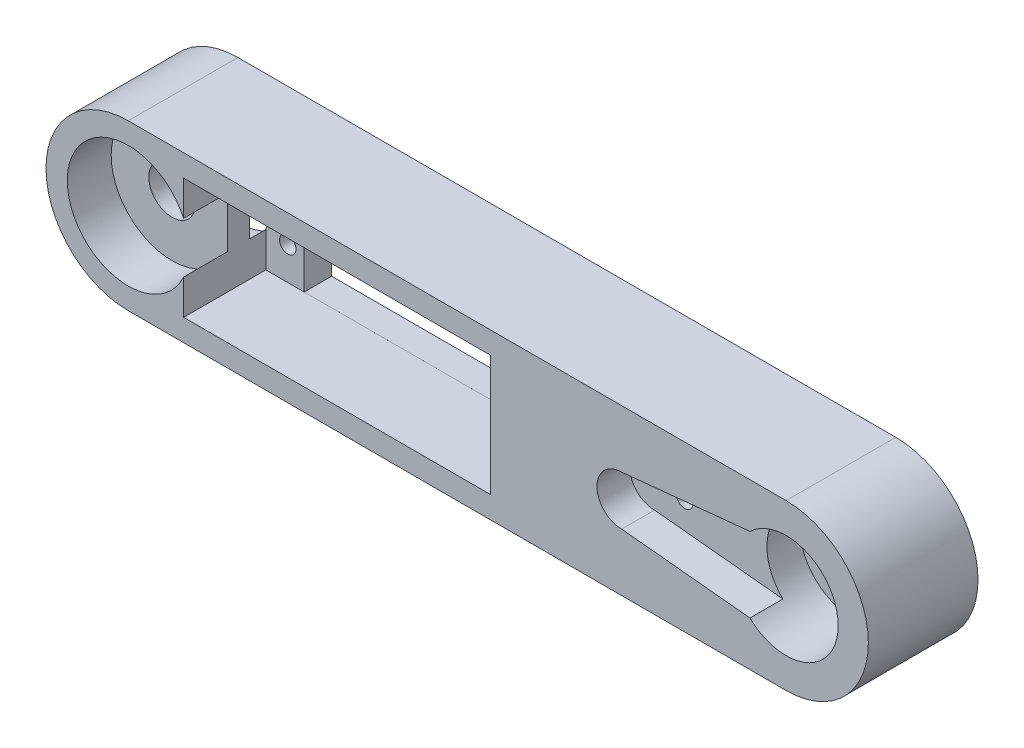
ISO-10303-21;
HEADER;
FILE_DESCRIPTION(('STEP AP214'),'2;1');
FILE_NAME('part.step','',(''),(''),'','','');
FILE_SCHEMA(('AUTOMOTIVE_DESIGN { 1 0 10303 214 1 1 1 1 }'));
ENDSEC;
DATA;
#1=APPLICATION_CONTEXT('core data for automotive mechanical design processes');
#2=APPLICATION_PROTOCOL_DEFINITION('international standard','automotive_design',2000,#1);
#3=PRODUCT_CONTEXT('',#1,'mechanical');
#4=PRODUCT('Part','Part','',(#3));
#5=PRODUCT_RELATED_PRODUCT_CATEGORY('part','',(#4));
#6=PRODUCT_DEFINITION_FORMATION('','',#4);
#7=PRODUCT_DEFINITION_CONTEXT('part definition',#1,'design');
#8=PRODUCT_DEFINITION('design','',#6,#7);
#9=PRODUCT_DEFINITION_SHAPE('','',#8);
#10=(LENGTH_UNIT() NAMED_UNIT(*) SI_UNIT(.MILLI.,.METRE.));
#11=(NAMED_UNIT(*) PLANE_ANGLE_UNIT() SI_UNIT($,.RADIAN.));
#12=(NAMED_UNIT(*) SI_UNIT($,.STERADIAN.) SOLID_ANGLE_UNIT());
#13=UNCERTAINTY_MEASURE_WITH_UNIT(LENGTH_MEASURE(1.E-05),#10,'distance_accuracy_value','');
#14=(GEOMETRIC_REPRESENTATION_CONTEXT(3) GLOBAL_UNCERTAINTY_ASSIGNED_CONTEXT((#13)) GLOBAL_UNIT_ASSIGNED_CONTEXT((#10,
#11,#12)) REPRESENTATION_CONTEXT('',''));
#15=CARTESIAN_POINT('',(0.,0.,0.));
#16=DIRECTION('',(0.,0.,1.));
#17=DIRECTION('',(1.,0.,0.));
#18=AXIS2_PLACEMENT_3D('',#15,#16,#17);
#19=CARTESIAN_POINT('',(0.,0.,-10.));
#20=DIRECTION('',(0.,0.,1.));
#21=DIRECTION('',(1.,0.,0.));
#22=AXIS2_PLACEMENT_3D('',#19,#20,#21);
#23=PLANE('',#22);
#24=CARTESIAN_POINT('',(14.1,-5.,-10.));
#25=DIRECTION('',(0.,0.,1.));
#26=DIRECTION('',(1.,0.,0.));
#27=AXIS2_PLACEMENT_3D('',#24,#25,#26);
#28=CIRCLE('',#27,1.5);
#29=CARTESIAN_POINT('',(15.6,-5.,-10.));
#30=VERTEX_POINT('',#29);
#31=EDGE_CURVE('E537',#30,#30,#28,.T.);
#32=ORIENTED_EDGE('',*,*,#31,.T.);
#33=EDGE_LOOP('',(#32));
#34=FACE_BOUND('',#33,.T.);
#35=CARTESIAN_POINT('',(14.1,5.,-10.));
#36=DIRECTION('',(0.,0.,1.));
#37=DIRECTION('',(1.,0.,0.));
#38=AXIS2_PLACEMENT_3D('',#35,#36,#37);
#39=CIRCLE('',#38,1.5);
#40=CARTESIAN_POINT('',(15.6,5.,-10.));
#41=VERTEX_POINT('',#40);
#42=EDGE_CURVE('E533',#41,#41,#39,.T.);
#43=ORIENTED_EDGE('',*,*,#42,.T.);
#44=EDGE_LOOP('',(#43));
#45=FACE_BOUND('',#44,.T.);
#46=CARTESIAN_POINT('',(0.,0.,-10.));
#47=DIRECTION('',(0.,0.,-1.));
#48=DIRECTION('',(-1.,0.,0.));
#49=AXIS2_PLACEMENT_3D('',#46,#47,#48);
#50=CIRCLE('',#49,11.11);
#51=CARTESIAN_POINT('',(-11.11,0.,-10.));
#52=VERTEX_POINT('',#51);
#53=EDGE_CURVE('E281',#52,#52,#50,.T.);
#54=ORIENTED_EDGE('',*,*,#53,.F.);
#55=EDGE_LOOP('',(#54));
#56=FACE_BOUND('',#55,.T.);
#57=DIRECTION('',(0.,1.,0.));
#58=VECTOR('',#57,1.);
#59=CARTESIAN_POINT('',(59.1,-11.,-10.));
#60=LINE('',#59,#58);
#61=CARTESIAN_POINT('',(59.1,-11.,-10.));
#62=VERTEX_POINT('',#61);
#63=CARTESIAN_POINT('',(59.1,11.,-10.));
#64=VERTEX_POINT('',#63);
#65=EDGE_CURVE('E357',#62,#64,#60,.T.);
#66=ORIENTED_EDGE('',*,*,#65,.T.);
#67=DIRECTION('',(-1.,0.,0.));
#68=VECTOR('',#67,1.);
#69=CARTESIAN_POINT('',(59.1,11.,-10.));
#70=LINE('',#69,#68);
#71=CARTESIAN_POINT('',(17.1,11.,-10.));
#72=VERTEX_POINT('',#71);
#73=EDGE_CURVE('E379',#64,#72,#70,.T.);
#74=ORIENTED_EDGE('',*,*,#73,.T.);
#75=DIRECTION('',(0.,1.,0.));
#76=VECTOR('',#75,1.);
#77=CARTESIAN_POINT('',(17.1,-11.,-10.));
#78=LINE('',#77,#76);
#79=CARTESIAN_POINT('',(17.1,-11.,-10.));
#80=VERTEX_POINT('',#79);
#81=EDGE_CURVE('E376',#80,#72,#78,.T.);
#82=ORIENTED_EDGE('',*,*,#81,.F.);
#83=DIRECTION('',(-1.,0.,0.));
#84=VECTOR('',#83,1.);
#85=CARTESIAN_POINT('',(59.1,-11.,-10.));
#86=LINE('',#85,#84);
#87=EDGE_CURVE('E372',#62,#80,#86,.T.);
#88=ORIENTED_EDGE('',*,*,#87,.F.);
#89=EDGE_LOOP('',(#66,#74,#82,#88));
#90=FACE_BOUND('',#89,.T.);
#91=CARTESIAN_POINT('',(120.,0.,-10.));
#92=DIRECTION('',(0.,0.,1.));
#93=DIRECTION('',(1.,0.,0.));
#94=AXIS2_PLACEMENT_3D('',#91,#92,#93);
#95=CIRCLE('',#94,4.25000000000001);
#96=CARTESIAN_POINT('',(124.25,0.,-10.));
#97=VERTEX_POINT('',#96);
#98=EDGE_CURVE('E383',#97,#97,#95,.T.);
#99=ORIENTED_EDGE('',*,*,#98,.T.);
#100=EDGE_LOOP('',(#99));
#101=FACE_BOUND('',#100,.T.);
#102=DIRECTION('',(1.,0.,0.));
#103=VECTOR('',#102,1.);
#104=CARTESIAN_POINT('',(0.,-15.,-10.));
#105=LINE('',#104,#103);
#106=CARTESIAN_POINT('',(0.,-15.,-10.));
#107=VERTEX_POINT('',#106);
#108=CARTESIAN_POINT('',(120.,-15.,-10.));
#109=VERTEX_POINT('',#108);
#110=EDGE_CURVE('E223',#107,#109,#105,.T.);
#111=ORIENTED_EDGE('',*,*,#110,.F.);
#112=CARTESIAN_POINT('',(0.,0.,-10.));
#113=DIRECTION('',(0.,0.,1.));
#114=DIRECTION('',(1.,0.,0.));
#115=AXIS2_PLACEMENT_3D('',#112,#113,#114);
#116=CIRCLE('',#115,15.);
#117=CARTESIAN_POINT('',(0.,15.,-10.));
#118=VERTEX_POINT('',#117);
#119=EDGE_CURVE('E233',#118,#107,#116,.T.);
#120=ORIENTED_EDGE('',*,*,#119,.F.);
#121=DIRECTION('',(1.,0.,0.));
#122=VECTOR('',#121,1.);
#123=CARTESIAN_POINT('',(0.,15.,-10.));
#124=LINE('',#123,#122);
#125=CARTESIAN_POINT('',(120.,15.,-10.));
#126=VERTEX_POINT('',#125);
#127=EDGE_CURVE('E251',#118,#126,#124,.T.);
#128=ORIENTED_EDGE('',*,*,#127,.T.);
#129=CARTESIAN_POINT('',(120.,0.,-10.));
#130=DIRECTION('',(0.,0.,1.));
#131=DIRECTION('',(1.,0.,0.));
#132=AXIS2_PLACEMENT_3D('',#129,#130,#131);
#133=CIRCLE('',#132,15.);
#134=EDGE_CURVE('E247',#109,#126,#133,.T.);
#135=ORIENTED_EDGE('',*,*,#134,.F.);
#136=EDGE_LOOP('',(#111,#120,#128,#135));
#137=FACE_BOUND('',#136,.T.);
#138=CARTESIAN_POINT('',(62.1,-5.00000000000001,-10.));
#139=DIRECTION('',(0.,0.,1.));
#140=DIRECTION('',(1.,0.,0.));
#141=AXIS2_PLACEMENT_3D('',#138,#139,#140);
#142=CIRCLE('',#141,1.49999999999998);
#143=CARTESIAN_POINT('',(63.6,-5.00000000000001,-10.));
#144=VERTEX_POINT('',#143);
#145=EDGE_CURVE('E540',#144,#144,#142,.F.);
#146=ORIENTED_EDGE('',*,*,#145,.F.);
#147=EDGE_LOOP('',(#146));
#148=FACE_BOUND('',#147,.T.);
#149=CARTESIAN_POINT('',(62.1,5.,-10.));
#150=DIRECTION('',(0.,0.,1.));
#151=DIRECTION('',(1.,0.,0.));
#152=AXIS2_PLACEMENT_3D('',#149,#150,#151);
#153=CIRCLE('',#152,1.5);
#154=CARTESIAN_POINT('',(63.6,5.,-10.));
#155=VERTEX_POINT('',#154);
#156=EDGE_CURVE('E544',#155,#155,#153,.F.);
#157=ORIENTED_EDGE('',*,*,#156,.F.);
#158=EDGE_LOOP('',(#157));
#159=FACE_BOUND('',#158,.T.);
#160=ADVANCED_FACE('F47',(#34,#45,#56,#90,#101,#137,#148,#159),#23,.F.);
#161=CARTESIAN_POINT('',(0.,0.,-5.));
#162=DIRECTION('',(0.,0.,1.));
#163=DIRECTION('',(1.,0.,0.));
#164=AXIS2_PLACEMENT_3D('',#161,#162,#163);
#165=PLANE('',#164);
#166=CARTESIAN_POINT('',(62.1,-5.00000000000001,-5.));
#167=DIRECTION('',(0.,0.,1.));
#168=DIRECTION('',(1.,0.,0.));
#169=AXIS2_PLACEMENT_3D('',#166,#167,#168);
#170=CIRCLE('',#169,1.49999999999998);
#171=CARTESIAN_POINT('',(63.6,-5.00000000000001,-5.));
#172=VERTEX_POINT('',#171);
#173=EDGE_CURVE('E521',#172,#172,#170,.F.);
#174=ORIENTED_EDGE('',*,*,#173,.T.);
#175=EDGE_LOOP('',(#174));
#176=FACE_BOUND('',#175,.T.);
#177=CARTESIAN_POINT('',(14.1,-5.,-5.));
#178=DIRECTION('',(0.,0.,1.));
#179=DIRECTION('',(1.,0.,0.));
#180=AXIS2_PLACEMENT_3D('',#177,#178,#179);
#181=CIRCLE('',#180,1.5);
#182=CARTESIAN_POINT('',(15.6,-5.,-5.));
#183=VERTEX_POINT('',#182);
#184=EDGE_CURVE('E525',#183,#183,#181,.T.);
#185=ORIENTED_EDGE('',*,*,#184,.F.);
#186=EDGE_LOOP('',(#185));
#187=FACE_BOUND('',#186,.T.);
#188=CARTESIAN_POINT('',(14.1,5.,-5.));
#189=DIRECTION('',(0.,0.,1.));
#190=DIRECTION('',(1.,0.,0.));
#191=AXIS2_PLACEMENT_3D('',#188,#189,#190);
#192=CIRCLE('',#191,1.5);
#193=CARTESIAN_POINT('',(15.6,5.,-5.));
#194=VERTEX_POINT('',#193);
#195=EDGE_CURVE('E529',#194,#194,#192,.T.);
#196=ORIENTED_EDGE('',*,*,#195,.F.);
#197=EDGE_LOOP('',(#196));
#198=FACE_BOUND('',#197,.T.);
#199=CARTESIAN_POINT('',(0.,0.,-5.));
#200=DIRECTION('',(0.,0.,1.));
#201=DIRECTION('',(1.,0.,0.));
#202=AXIS2_PLACEMENT_3D('',#199,#200,#201);
#203=CIRCLE('',#202,11.11);
#204=CARTESIAN_POINT('',(10.1,4.62840145190541,-5.));
#205=VERTEX_POINT('',#204);
#206=CARTESIAN_POINT('',(10.1,-4.62840145190541,-5.));
#207=VERTEX_POINT('',#206);
#208=EDGE_CURVE('E56',#205,#207,#203,.F.);
#209=ORIENTED_EDGE('',*,*,#208,.T.);
#210=DIRECTION('',(0.,-1.,0.));
#211=VECTOR('',#210,1.);
#212=CARTESIAN_POINT('',(10.1,-11.0013577689779,-5.));
#213=LINE('',#212,#211);
#214=CARTESIAN_POINT('',(10.1,-11.0013577689779,-5.));
#215=VERTEX_POINT('',#214);
#216=EDGE_CURVE('E293',#207,#215,#213,.T.);
#217=ORIENTED_EDGE('',*,*,#216,.T.);
#218=DIRECTION('',(1.,0.,0.));
#219=VECTOR('',#218,1.);
#220=CARTESIAN_POINT('',(66.1,-11.0013577689779,-5.));
#221=LINE('',#220,#219);
#222=CARTESIAN_POINT('',(66.1,-11.0013577689779,-5.));
#223=VERTEX_POINT('',#222);
#224=EDGE_CURVE('E550',#215,#223,#221,.T.);
#225=ORIENTED_EDGE('',*,*,#224,.T.);
#226=DIRECTION('',(0.,1.,0.));
#227=VECTOR('',#226,1.);
#228=CARTESIAN_POINT('',(66.1,-11.0013577689779,-5.));
#229=LINE('',#228,#227);
#230=CARTESIAN_POINT('',(66.1,11.0013577689779,-5.));
#231=VERTEX_POINT('',#230);
#232=EDGE_CURVE('E553',#223,#231,#229,.T.);
#233=ORIENTED_EDGE('',*,*,#232,.T.);
#234=DIRECTION('',(-1.,0.,0.));
#235=VECTOR('',#234,1.);
#236=CARTESIAN_POINT('',(66.1,11.0013577689779,-5.));
#237=LINE('',#236,#235);
#238=CARTESIAN_POINT('',(10.1,11.0013577689779,-5.));
#239=VERTEX_POINT('',#238);
#240=EDGE_CURVE('E557',#231,#239,#237,.T.);
#241=ORIENTED_EDGE('',*,*,#240,.T.);
#242=EDGE_CURVE('E297',#239,#205,#213,.T.);
#243=ORIENTED_EDGE('',*,*,#242,.T.);
#244=EDGE_LOOP('',(#209,#217,#225,#233,#241,#243));
#245=FACE_BOUND('',#244,.T.);
#246=DIRECTION('',(1.,0.,0.));
#247=VECTOR('',#246,1.);
#248=CARTESIAN_POINT('',(59.1,11.,-5.));
#249=LINE('',#248,#247);
#250=CARTESIAN_POINT('',(17.1,11.,-5.));
#251=VERTEX_POINT('',#250);
#252=CARTESIAN_POINT('',(59.1,11.,-5.));
#253=VERTEX_POINT('',#252);
#254=EDGE_CURVE('E338',#251,#253,#249,.T.);
#255=ORIENTED_EDGE('',*,*,#254,.T.);
#256=DIRECTION('',(0.,-1.,0.));
#257=VECTOR('',#256,1.);
#258=CARTESIAN_POINT('',(59.1,-11.,-5.));
#259=LINE('',#258,#257);
#260=CARTESIAN_POINT('',(59.1,-11.,-5.));
#261=VERTEX_POINT('',#260);
#262=EDGE_CURVE('E335',#253,#261,#259,.T.);
#263=ORIENTED_EDGE('',*,*,#262,.T.);
#264=DIRECTION('',(1.,0.,0.));
#265=VECTOR('',#264,1.);
#266=CARTESIAN_POINT('',(59.1,-11.,-5.));
#267=LINE('',#266,#265);
#268=CARTESIAN_POINT('',(17.1,-11.,-5.));
#269=VERTEX_POINT('',#268);
#270=EDGE_CURVE('E70',#269,#261,#267,.T.);
#271=ORIENTED_EDGE('',*,*,#270,.F.);
#272=DIRECTION('',(0.,-1.,0.));
#273=VECTOR('',#272,1.);
#274=CARTESIAN_POINT('',(17.1,-11.,-5.));
#275=LINE('',#274,#273);
#276=EDGE_CURVE('E330',#251,#269,#275,.T.);
#277=ORIENTED_EDGE('',*,*,#276,.F.);
#278=EDGE_LOOP('',(#255,#263,#271,#277));
#279=FACE_BOUND('',#278,.T.);
#280=CARTESIAN_POINT('',(62.1,5.,-5.));
#281=DIRECTION('',(0.,0.,-1.));
#282=DIRECTION('',(-1.,0.,0.));
#283=AXIS2_PLACEMENT_3D('',#280,#281,#282);
#284=CIRCLE('',#283,1.5);
#285=CARTESIAN_POINT('',(60.6,5.,-5.));
#286=VERTEX_POINT('',#285);
#287=EDGE_CURVE('E203',#286,#286,#284,.T.);
#288=ORIENTED_EDGE('',*,*,#287,.T.);
#289=EDGE_LOOP('',(#288));
#290=FACE_BOUND('',#289,.T.);
#291=ADVANCED_FACE('F291',(#176,#187,#198,#245,#279,#290),#165,.T.);
#292=CARTESIAN_POINT('',(59.1,11.,-10.));
#293=DIRECTION('',(0.,1.,0.));
#294=DIRECTION('',(-1.,0.,0.));
#295=AXIS2_PLACEMENT_3D('',#292,#293,#294);
#296=PLANE('',#295);
#297=ORIENTED_EDGE('',*,*,#254,.F.);
#298=DIRECTION('',(0.,0.,1.));
#299=VECTOR('',#298,1.);
#300=CARTESIAN_POINT('',(17.1,11.,-10.));
#301=LINE('',#300,#299);
#302=EDGE_CURVE('E353',#72,#251,#301,.T.);
#303=ORIENTED_EDGE('',*,*,#302,.F.);
#304=ORIENTED_EDGE('',*,*,#73,.F.);
#305=DIRECTION('',(0.,0.,1.));
#306=VECTOR('',#305,1.);
#307=CARTESIAN_POINT('',(59.1,11.,-10.));
#308=LINE('',#307,#306);
#309=EDGE_CURVE('E275',#64,#253,#308,.T.);
#310=ORIENTED_EDGE('',*,*,#309,.T.);
#311=EDGE_LOOP('',(#297,#303,#304,#310));
#312=FACE_BOUND('',#311,.T.);
#313=ADVANCED_FACE('F441',(#312),#296,.F.);
#314=CARTESIAN_POINT('',(59.1,-11.,-10.));
#315=DIRECTION('',(1.,0.,0.));
#316=DIRECTION('',(0.,0.,-1.));
#317=AXIS2_PLACEMENT_3D('',#314,#315,#316);
#318=PLANE('',#317);
#319=ORIENTED_EDGE('',*,*,#262,.F.);
#320=ORIENTED_EDGE('',*,*,#309,.F.);
#321=ORIENTED_EDGE('',*,*,#65,.F.);
#322=DIRECTION('',(0.,0.,1.));
#323=VECTOR('',#322,1.);
#324=CARTESIAN_POINT('',(59.1,-11.,-10.));
#325=LINE('',#324,#323);
#326=EDGE_CURVE('E362',#62,#261,#325,.T.);
#327=ORIENTED_EDGE('',*,*,#326,.T.);
#328=EDGE_LOOP('',(#319,#320,#321,#327));
#329=FACE_BOUND('',#328,.T.);
#330=ADVANCED_FACE('F497',(#329),#318,.F.);
#331=CARTESIAN_POINT('',(59.1,-11.,-10.));
#332=DIRECTION('',(0.,1.,0.));
#333=DIRECTION('',(-1.,0.,0.));
#334=AXIS2_PLACEMENT_3D('',#331,#332,#333);
#335=PLANE('',#334);
#336=DIRECTION('',(0.,0.,1.));
#337=VECTOR('',#336,1.);
#338=CARTESIAN_POINT('',(17.1,-11.,-10.));
#339=LINE('',#338,#337);
#340=EDGE_CURVE('E358',#80,#269,#339,.T.);
#341=ORIENTED_EDGE('',*,*,#340,.T.);
#342=ORIENTED_EDGE('',*,*,#270,.T.);
#343=ORIENTED_EDGE('',*,*,#326,.F.);
#344=ORIENTED_EDGE('',*,*,#87,.T.);
#345=EDGE_LOOP('',(#341,#342,#343,#344));
#346=FACE_BOUND('',#345,.T.);
#347=ADVANCED_FACE('F489',(#346),#335,.T.);
#348=CARTESIAN_POINT('',(17.1,-11.,-10.));
#349=DIRECTION('',(1.,0.,0.));
#350=DIRECTION('',(0.,0.,-1.));
#351=AXIS2_PLACEMENT_3D('',#348,#349,#350);
#352=PLANE('',#351);
#353=ORIENTED_EDGE('',*,*,#302,.T.);
#354=ORIENTED_EDGE('',*,*,#276,.T.);
#355=ORIENTED_EDGE('',*,*,#340,.F.);
#356=ORIENTED_EDGE('',*,*,#81,.T.);
#357=EDGE_LOOP('',(#353,#354,#355,#356));
#358=FACE_BOUND('',#357,.T.);
#359=ADVANCED_FACE('F482',(#358),#352,.T.);
#360=CARTESIAN_POINT('',(0.,0.,-10.));
#361=DIRECTION('',(0.,0.,1.));
#362=DIRECTION('',(1.,0.,0.));
#363=AXIS2_PLACEMENT_3D('',#360,#361,#362);
#364=CYLINDRICAL_SURFACE('',#363,4.25);
#365=CARTESIAN_POINT('',(0.,0.,-2.));
#366=DIRECTION('',(0.,0.,-1.));
#367=DIRECTION('',(-1.,0.,0.));
#368=AXIS2_PLACEMENT_3D('',#365,#366,#367);
#369=CIRCLE('',#368,4.25);
#370=CARTESIAN_POINT('',(-4.25,0.,-2.));
#371=VERTEX_POINT('',#370);
#372=EDGE_CURVE('E271',#371,#371,#369,.F.);
#373=ORIENTED_EDGE('',*,*,#372,.F.);
#374=EDGE_LOOP('',(#373));
#375=FACE_BOUND('',#374,.T.);
#376=CARTESIAN_POINT('',(0.,0.,2.));
#377=DIRECTION('',(0.,0.,1.));
#378=DIRECTION('',(1.,0.,0.));
#379=AXIS2_PLACEMENT_3D('',#376,#377,#378);
#380=CIRCLE('',#379,4.25);
#381=CARTESIAN_POINT('',(4.25,0.,2.));
#382=VERTEX_POINT('',#381);
#383=EDGE_CURVE('E277',#382,#382,#380,.F.);
#384=ORIENTED_EDGE('',*,*,#383,.F.);
#385=EDGE_LOOP('',(#384));
#386=FACE_BOUND('',#385,.T.);
#387=ADVANCED_FACE('F476',(#375,#386),#364,.F.);
#388=CARTESIAN_POINT('',(0.,0.,10.));
#389=DIRECTION('',(0.,0.,1.));
#390=DIRECTION('',(1.,0.,0.));
#391=AXIS2_PLACEMENT_3D('',#388,#389,#390);
#392=PLANE('',#391);
#393=CARTESIAN_POINT('',(120.,0.,10.));
#394=DIRECTION('',(0.,0.,1.));
#395=DIRECTION('',(1.,0.,0.));
#396=AXIS2_PLACEMENT_3D('',#393,#394,#395);
#397=CIRCLE('',#396,9.50000000000001);
#398=CARTESIAN_POINT('',(113.408085364,-6.84080853639996,10.));
#399=VERTEX_POINT('',#398);
#400=CARTESIAN_POINT('',(113.408085364,6.84080853639996,10.));
#401=VERTEX_POINT('',#400);
#402=EDGE_CURVE('E182',#399,#401,#397,.T.);
#403=ORIENTED_EDGE('',*,*,#402,.F.);
#404=DIRECTION('',(0.995037190209989,-0.0995037190209992,0.));
#405=VECTOR('',#404,1.);
#406=CARTESIAN_POINT('',(0.445544554455448,4.45544554455447,10.));
#407=LINE('',#406,#405);
#408=CARTESIAN_POINT('',(90.,-4.5,10.));
#409=VERTEX_POINT('',#408);
#410=EDGE_CURVE('E210',#409,#399,#407,.T.);
#411=ORIENTED_EDGE('',*,*,#410,.F.);
#412=CARTESIAN_POINT('',(90.,0.,10.));
#413=DIRECTION('',(0.,0.,1.));
#414=DIRECTION('',(1.,0.,0.));
#415=AXIS2_PLACEMENT_3D('',#412,#413,#414);
#416=CIRCLE('',#415,4.5);
#417=CARTESIAN_POINT('',(90.,4.5,10.));
#418=VERTEX_POINT('',#417);
#419=EDGE_CURVE('E207',#418,#409,#416,.T.);
#420=ORIENTED_EDGE('',*,*,#419,.F.);
#421=DIRECTION('',(0.995037190209989,0.0995037190209992,0.));
#422=VECTOR('',#421,1.);
#423=CARTESIAN_POINT('',(0.445544554455448,-4.45544554455447,10.));
#424=LINE('',#423,#422);
#425=EDGE_CURVE('E198',#418,#401,#424,.T.);
#426=ORIENTED_EDGE('',*,*,#425,.T.);
#427=EDGE_LOOP('',(#403,#411,#420,#426));
#428=FACE_BOUND('',#427,.T.);
#429=DIRECTION('',(0.,-1.,0.));
#430=VECTOR('',#429,1.);
#431=CARTESIAN_POINT('',(10.1,-11.0013577689779,10.));
#432=LINE('',#431,#430);
#433=CARTESIAN_POINT('',(10.1,11.0013577689779,10.));
#434=VERTEX_POINT('',#433);
#435=CARTESIAN_POINT('',(10.1,4.62840145190541,10.));
#436=VERTEX_POINT('',#435);
#437=EDGE_CURVE('E560',#434,#436,#432,.T.);
#438=ORIENTED_EDGE('',*,*,#437,.F.);
#439=DIRECTION('',(-1.,0.,0.));
#440=VECTOR('',#439,1.);
#441=CARTESIAN_POINT('',(66.1,11.0013577689779,10.));
#442=LINE('',#441,#440);
#443=CARTESIAN_POINT('',(66.1,11.0013577689779,10.));
#444=VERTEX_POINT('',#443);
#445=EDGE_CURVE('E310',#444,#434,#442,.T.);
#446=ORIENTED_EDGE('',*,*,#445,.F.);
#447=DIRECTION('',(0.,1.,0.));
#448=VECTOR('',#447,1.);
#449=CARTESIAN_POINT('',(66.1,-11.0013577689779,10.));
#450=LINE('',#449,#448);
#451=CARTESIAN_POINT('',(66.1,-11.0013577689779,10.));
#452=VERTEX_POINT('',#451);
#453=EDGE_CURVE('E567',#452,#444,#450,.T.);
#454=ORIENTED_EDGE('',*,*,#453,.F.);
#455=DIRECTION('',(1.,0.,0.));
#456=VECTOR('',#455,1.);
#457=CARTESIAN_POINT('',(66.1,-11.0013577689779,10.));
#458=LINE('',#457,#456);
#459=CARTESIAN_POINT('',(10.1,-11.0013577689779,10.));
#460=VERTEX_POINT('',#459);
#461=EDGE_CURVE('E563',#460,#452,#458,.T.);
#462=ORIENTED_EDGE('',*,*,#461,.F.);
#463=CARTESIAN_POINT('',(10.1,-4.62840145190541,10.));
#464=VERTEX_POINT('',#463);
#465=EDGE_CURVE('E547',#464,#460,#432,.T.);
#466=ORIENTED_EDGE('',*,*,#465,.F.);
#467=CARTESIAN_POINT('',(0.,0.,10.));
#468=DIRECTION('',(0.,0.,-1.));
#469=DIRECTION('',(-1.,0.,0.));
#470=AXIS2_PLACEMENT_3D('',#467,#468,#469);
#471=CIRCLE('',#470,11.11);
#472=EDGE_CURVE('E341',#464,#436,#471,.T.);
#473=ORIENTED_EDGE('',*,*,#472,.T.);
#474=EDGE_LOOP('',(#438,#446,#454,#462,#466,#473));
#475=FACE_BOUND('',#474,.T.);
#476=DIRECTION('',(1.,0.,0.));
#477=VECTOR('',#476,1.);
#478=CARTESIAN_POINT('',(0.,-15.,10.));
#479=LINE('',#478,#477);
#480=CARTESIAN_POINT('',(0.,-15.,10.));
#481=VERTEX_POINT('',#480);
#482=CARTESIAN_POINT('',(120.,-15.,10.));
#483=VERTEX_POINT('',#482);
#484=EDGE_CURVE('E228',#481,#483,#479,.T.);
#485=ORIENTED_EDGE('',*,*,#484,.T.);
#486=CARTESIAN_POINT('',(120.,0.,10.));
#487=DIRECTION('',(0.,0.,1.));
#488=DIRECTION('',(1.,0.,0.));
#489=AXIS2_PLACEMENT_3D('',#486,#487,#488);
#490=CIRCLE('',#489,15.);
#491=CARTESIAN_POINT('',(120.,15.,10.));
#492=VERTEX_POINT('',#491);
#493=EDGE_CURVE('E232',#483,#492,#490,.T.);
#494=ORIENTED_EDGE('',*,*,#493,.T.);
#495=DIRECTION('',(1.,0.,0.));
#496=VECTOR('',#495,1.);
#497=CARTESIAN_POINT('',(0.,15.,10.));
#498=LINE('',#497,#496);
#499=CARTESIAN_POINT('',(0.,15.,10.));
#500=VERTEX_POINT('',#499);
#501=EDGE_CURVE('E236',#500,#492,#498,.T.);
#502=ORIENTED_EDGE('',*,*,#501,.F.);
#503=CARTESIAN_POINT('',(0.,0.,10.));
#504=DIRECTION('',(0.,0.,1.));
#505=DIRECTION('',(1.,0.,0.));
#506=AXIS2_PLACEMENT_3D('',#503,#504,#505);
#507=CIRCLE('',#506,15.);
#508=EDGE_CURVE('E240',#500,#481,#507,.T.);
#509=ORIENTED_EDGE('',*,*,#508,.T.);
#510=EDGE_LOOP('',(#485,#494,#502,#509));
#511=FACE_BOUND('',#510,.T.);
#512=ADVANCED_FACE('F205',(#428,#475,#511),#392,.T.);
#513=CARTESIAN_POINT('',(0.,-15.,10.));
#514=DIRECTION('',(0.,1.,0.));
#515=DIRECTION('',(-1.,0.,0.));
#516=AXIS2_PLACEMENT_3D('',#513,#514,#515);
#517=PLANE('',#516);
#518=ORIENTED_EDGE('',*,*,#110,.T.);
#519=DIRECTION('',(0.,0.,-1.));
#520=VECTOR('',#519,1.);
#521=CARTESIAN_POINT('',(120.,-15.,10.));
#522=LINE('',#521,#520);
#523=EDGE_CURVE('E266',#483,#109,#522,.T.);
#524=ORIENTED_EDGE('',*,*,#523,.F.);
#525=ORIENTED_EDGE('',*,*,#484,.F.);
#526=DIRECTION('',(0.,0.,-1.));
#527=VECTOR('',#526,1.);
#528=CARTESIAN_POINT('',(0.,-15.,10.));
#529=LINE('',#528,#527);
#530=EDGE_CURVE('E243',#481,#107,#529,.T.);
#531=ORIENTED_EDGE('',*,*,#530,.T.);
#532=EDGE_LOOP('',(#518,#524,#525,#531));
#533=FACE_BOUND('',#532,.T.);
#534=ADVANCED_FACE('F49',(#533),#517,.F.);
#535=CARTESIAN_POINT('',(120.,0.,10.));
#536=DIRECTION('',(0.,0.,-1.));
#537=DIRECTION('',(-1.,0.,0.));
#538=AXIS2_PLACEMENT_3D('',#535,#536,#537);
#539=CYLINDRICAL_SURFACE('',#538,15.);
#540=ORIENTED_EDGE('',*,*,#134,.T.);
#541=DIRECTION('',(0.,0.,-1.));
#542=VECTOR('',#541,1.);
#543=CARTESIAN_POINT('',(120.,15.,10.));
#544=LINE('',#543,#542);
#545=EDGE_CURVE('E263',#492,#126,#544,.T.);
#546=ORIENTED_EDGE('',*,*,#545,.F.);
#547=ORIENTED_EDGE('',*,*,#493,.F.);
#548=ORIENTED_EDGE('',*,*,#523,.T.);
#549=EDGE_LOOP('',(#540,#546,#547,#548));
#550=FACE_BOUND('',#549,.T.);
#551=ADVANCED_FACE('F455',(#550),#539,.T.);
#552=CARTESIAN_POINT('',(0.,15.,10.));
#553=DIRECTION('',(0.,1.,0.));
#554=DIRECTION('',(-1.,0.,0.));
#555=AXIS2_PLACEMENT_3D('',#552,#553,#554);
#556=PLANE('',#555);
#557=ORIENTED_EDGE('',*,*,#127,.F.);
#558=DIRECTION('',(0.,0.,-1.));
#559=VECTOR('',#558,1.);
#560=CARTESIAN_POINT('',(0.,15.,10.));
#561=LINE('',#560,#559);
#562=EDGE_CURVE('E260',#500,#118,#561,.T.);
#563=ORIENTED_EDGE('',*,*,#562,.F.);
#564=ORIENTED_EDGE('',*,*,#501,.T.);
#565=ORIENTED_EDGE('',*,*,#545,.T.);
#566=EDGE_LOOP('',(#557,#563,#564,#565));
#567=FACE_BOUND('',#566,.T.);
#568=ADVANCED_FACE('F452',(#567),#556,.T.);
#569=CARTESIAN_POINT('',(0.,0.,10.));
#570=DIRECTION('',(0.,0.,-1.));
#571=DIRECTION('',(-1.,0.,0.));
#572=AXIS2_PLACEMENT_3D('',#569,#570,#571);
#573=CYLINDRICAL_SURFACE('',#572,15.);
#574=ORIENTED_EDGE('',*,*,#119,.T.);
#575=ORIENTED_EDGE('',*,*,#530,.F.);
#576=ORIENTED_EDGE('',*,*,#508,.F.);
#577=ORIENTED_EDGE('',*,*,#562,.T.);
#578=EDGE_LOOP('',(#574,#575,#576,#577));
#579=FACE_BOUND('',#578,.T.);
#580=ADVANCED_FACE('F449',(#579),#573,.T.);
#581=CARTESIAN_POINT('',(90.,0.,4.));
#582=DIRECTION('',(0.,0.,1.));
#583=DIRECTION('',(1.,0.,0.));
#584=AXIS2_PLACEMENT_3D('',#581,#582,#583);
#585=CYLINDRICAL_SURFACE('',#584,4.5);
#586=ORIENTED_EDGE('',*,*,#419,.T.);
#587=DIRECTION('',(0.,0.,1.));
#588=VECTOR('',#587,1.);
#589=CARTESIAN_POINT('',(90.,-4.5,4.));
#590=LINE('',#589,#588);
#591=CARTESIAN_POINT('',(90.,-4.5,4.));
#592=VERTEX_POINT('',#591);
#593=EDGE_CURVE('E224',#592,#409,#590,.T.);
#594=ORIENTED_EDGE('',*,*,#593,.F.);
#595=CARTESIAN_POINT('',(90.,0.,4.));
#596=DIRECTION('',(0.,0.,1.));
#597=DIRECTION('',(1.,0.,0.));
#598=AXIS2_PLACEMENT_3D('',#595,#596,#597);
#599=CIRCLE('',#598,4.5);
#600=CARTESIAN_POINT('',(90.,4.5,4.));
#601=VERTEX_POINT('',#600);
#602=EDGE_CURVE('E209',#601,#592,#599,.T.);
#603=ORIENTED_EDGE('',*,*,#602,.F.);
#604=DIRECTION('',(0.,0.,1.));
#605=VECTOR('',#604,1.);
#606=CARTESIAN_POINT('',(90.,4.5,4.));
#607=LINE('',#606,#605);
#608=EDGE_CURVE('E220',#601,#418,#607,.T.);
#609=ORIENTED_EDGE('',*,*,#608,.T.);
#610=EDGE_LOOP('',(#586,#594,#603,#609));
#611=FACE_BOUND('',#610,.T.);
#612=ADVANCED_FACE('F405',(#611),#585,.F.);
#613=CARTESIAN_POINT('',(0.445544554455448,-4.45544554455447,4.));
#614=DIRECTION('',(0.0995037190209992,-0.995037190209989,0.));
#615=DIRECTION('',(0.995037190209989,0.0995037190209992,0.));
#616=AXIS2_PLACEMENT_3D('',#613,#614,#615);
#617=PLANE('',#616);
#618=DIRECTION('',(0.,0.,1.));
#619=VECTOR('',#618,1.);
#620=CARTESIAN_POINT('',(113.408085364,6.84080853639996,-28.8700576850888));
#621=LINE('',#620,#619);
#622=CARTESIAN_POINT('',(113.408085364,6.84080853639996,4.));
#623=VERTEX_POINT('',#622);
#624=EDGE_CURVE('E62',#401,#623,#621,.F.);
#625=ORIENTED_EDGE('',*,*,#624,.F.);
#626=ORIENTED_EDGE('',*,*,#425,.F.);
#627=ORIENTED_EDGE('',*,*,#608,.F.);
#628=DIRECTION('',(0.995037190209989,0.0995037190209992,0.));
#629=VECTOR('',#628,1.);
#630=CARTESIAN_POINT('',(0.445544554455448,-4.45544554455447,4.));
#631=LINE('',#630,#629);
#632=EDGE_CURVE('E201',#601,#623,#631,.T.);
#633=ORIENTED_EDGE('',*,*,#632,.T.);
#634=EDGE_LOOP('',(#625,#626,#627,#633));
#635=FACE_BOUND('',#634,.T.);
#636=ADVANCED_FACE('F197',(#635),#617,.T.);
#637=CARTESIAN_POINT('',(0.445544554455448,4.45544554455447,4.));
#638=DIRECTION('',(-0.0995037190209992,-0.995037190209989,0.));
#639=DIRECTION('',(0.995037190209989,-0.0995037190209992,0.));
#640=AXIS2_PLACEMENT_3D('',#637,#638,#639);
#641=PLANE('',#640);
#642=ORIENTED_EDGE('',*,*,#410,.T.);
#643=DIRECTION('',(0.,0.,1.));
#644=VECTOR('',#643,1.);
#645=CARTESIAN_POINT('',(113.408085364,-6.84080853639996,-28.8700576850888));
#646=LINE('',#645,#644);
#647=CARTESIAN_POINT('',(113.408085364,-6.84080853639996,4.));
#648=VERTEX_POINT('',#647);
#649=EDGE_CURVE('E186',#399,#648,#646,.F.);
#650=ORIENTED_EDGE('',*,*,#649,.T.);
#651=DIRECTION('',(0.995037190209989,-0.0995037190209992,0.));
#652=VECTOR('',#651,1.);
#653=CARTESIAN_POINT('',(0.445544554455448,4.45544554455447,4.));
#654=LINE('',#653,#652);
#655=EDGE_CURVE('E215',#592,#648,#654,.T.);
#656=ORIENTED_EDGE('',*,*,#655,.F.);
#657=ORIENTED_EDGE('',*,*,#593,.T.);
#658=EDGE_LOOP('',(#642,#650,#656,#657));
#659=FACE_BOUND('',#658,.T.);
#660=ADVANCED_FACE('F409',(#659),#641,.F.);
#661=CARTESIAN_POINT('',(0.,0.,4.));
#662=DIRECTION('',(0.,0.,1.));
#663=DIRECTION('',(1.,0.,0.));
#664=AXIS2_PLACEMENT_3D('',#661,#662,#663);
#665=PLANE('',#664);
#666=CARTESIAN_POINT('',(120.,0.,4.));
#667=DIRECTION('',(0.,0.,1.));
#668=DIRECTION('',(1.,0.,0.));
#669=AXIS2_PLACEMENT_3D('',#666,#667,#668);
#670=CIRCLE('',#669,9.50000000000001);
#671=EDGE_CURVE('E11',#623,#648,#670,.T.);
#672=ORIENTED_EDGE('',*,*,#671,.F.);
#673=ORIENTED_EDGE('',*,*,#632,.F.);
#674=ORIENTED_EDGE('',*,*,#602,.T.);
#675=ORIENTED_EDGE('',*,*,#655,.T.);
#676=EDGE_LOOP('',(#672,#673,#674,#675));
#677=FACE_BOUND('',#676,.T.);
#678=CARTESIAN_POINT('',(95.5,0.,4.));
#679=DIRECTION('',(0.,0.,1.));
#680=DIRECTION('',(1.,0.,0.));
#681=AXIS2_PLACEMENT_3D('',#678,#679,#680);
#682=CIRCLE('',#681,1.5);
#683=CARTESIAN_POINT('',(97.,0.,4.));
#684=VERTEX_POINT('',#683);
#685=EDGE_CURVE('E395',#684,#684,#682,.T.);
#686=ORIENTED_EDGE('',*,*,#685,.F.);
#687=EDGE_LOOP('',(#686));
#688=FACE_BOUND('',#687,.T.);
#689=ADVANCED_FACE('F411',(#677,#688),#665,.T.);
#690=CARTESIAN_POINT('',(0.,0.,-2.));
#691=DIRECTION('',(0.,0.,1.));
#692=DIRECTION('',(1.,0.,0.));
#693=AXIS2_PLACEMENT_3D('',#690,#691,#692);
#694=PLANE('',#693);
#695=CARTESIAN_POINT('',(120.,0.,-2.));
#696=DIRECTION('',(0.,0.,1.));
#697=DIRECTION('',(1.,0.,0.));
#698=AXIS2_PLACEMENT_3D('',#695,#696,#697);
#699=CIRCLE('',#698,4.25000000000001);
#700=CARTESIAN_POINT('',(124.25,0.,-2.));
#701=VERTEX_POINT('',#700);
#702=EDGE_CURVE('E387',#701,#701,#699,.T.);
#703=ORIENTED_EDGE('',*,*,#702,.F.);
#704=EDGE_LOOP('',(#703));
#705=FACE_BOUND('',#704,.T.);
#706=CARTESIAN_POINT('',(120.,0.,-2.));
#707=DIRECTION('',(0.,0.,1.));
#708=DIRECTION('',(1.,0.,0.));
#709=AXIS2_PLACEMENT_3D('',#706,#707,#708);
#710=CIRCLE('',#709,9.50000000000001);
#711=CARTESIAN_POINT('',(129.5,0.,-2.));
#712=VERTEX_POINT('',#711);
#713=EDGE_CURVE('E192',#712,#712,#710,.F.);
#714=ORIENTED_EDGE('',*,*,#713,.F.);
#715=EDGE_LOOP('',(#714));
#716=FACE_BOUND('',#715,.T.);
#717=ADVANCED_FACE('F414',(#705,#716),#694,.T.);
#718=CARTESIAN_POINT('',(95.5,0.,-2.));
#719=DIRECTION('',(0.,0.,1.));
#720=DIRECTION('',(1.,0.,0.));
#721=AXIS2_PLACEMENT_3D('',#718,#719,#720);
#722=CYLINDRICAL_SURFACE('',#721,1.5);
#723=ORIENTED_EDGE('',*,*,#685,.T.);
#724=EDGE_LOOP('',(#723));
#725=FACE_BOUND('',#724,.T.);
#726=CARTESIAN_POINT('',(95.5,0.,-2.));
#727=DIRECTION('',(0.,0.,1.));
#728=DIRECTION('',(1.,0.,0.));
#729=AXIS2_PLACEMENT_3D('',#726,#727,#728);
#730=CIRCLE('',#729,1.5);
#731=CARTESIAN_POINT('',(97.,0.,-2.));
#732=VERTEX_POINT('',#731);
#733=EDGE_CURVE('E391',#732,#732,#730,.T.);
#734=ORIENTED_EDGE('',*,*,#733,.F.);
#735=EDGE_LOOP('',(#734));
#736=FACE_BOUND('',#735,.T.);
#737=ADVANCED_FACE('F418',(#725,#736),#722,.F.);
#738=CARTESIAN_POINT('',(0.,0.,-2.));
#739=DIRECTION('',(0.,0.,1.));
#740=DIRECTION('',(1.,0.,0.));
#741=AXIS2_PLACEMENT_3D('',#738,#739,#740);
#742=PLANE('',#741);
#743=ORIENTED_EDGE('',*,*,#733,.T.);
#744=EDGE_LOOP('',(#743));
#745=FACE_BOUND('',#744,.T.);
#746=ADVANCED_FACE('F421',(#745),#742,.T.);
#747=CARTESIAN_POINT('',(120.,0.,-10.));
#748=DIRECTION('',(0.,0.,1.));
#749=DIRECTION('',(1.,0.,0.));
#750=AXIS2_PLACEMENT_3D('',#747,#748,#749);
#751=CYLINDRICAL_SURFACE('',#750,4.25000000000001);
#752=ORIENTED_EDGE('',*,*,#702,.T.);
#753=EDGE_LOOP('',(#752));
#754=FACE_BOUND('',#753,.T.);
#755=ORIENTED_EDGE('',*,*,#98,.F.);
#756=EDGE_LOOP('',(#755));
#757=FACE_BOUND('',#756,.T.);
#758=ADVANCED_FACE('F426',(#754,#757),#751,.F.);
#759=CARTESIAN_POINT('',(0.,0.,-2.));
#760=DIRECTION('',(0.,0.,-1.));
#761=DIRECTION('',(-1.,0.,0.));
#762=AXIS2_PLACEMENT_3D('',#759,#760,#761);
#763=PLANE('',#762);
#764=DIRECTION('',(0.,1.,0.));
#765=VECTOR('',#764,1.);
#766=CARTESIAN_POINT('',(10.1,0.,-2.));
#767=LINE('',#766,#765);
#768=CARTESIAN_POINT('',(10.1,-4.62840145190541,-2.));
#769=VERTEX_POINT('',#768);
#770=CARTESIAN_POINT('',(10.1,4.62840145190541,-2.));
#771=VERTEX_POINT('',#770);
#772=EDGE_CURVE('E317',#769,#771,#767,.T.);
#773=ORIENTED_EDGE('',*,*,#772,.F.);
#774=CARTESIAN_POINT('',(0.,0.,-2.));
#775=DIRECTION('',(0.,0.,-1.));
#776=DIRECTION('',(-1.,0.,0.));
#777=AXIS2_PLACEMENT_3D('',#774,#775,#776);
#778=CIRCLE('',#777,11.11);
#779=EDGE_CURVE('E276',#769,#771,#778,.T.);
#780=ORIENTED_EDGE('',*,*,#779,.T.);
#781=EDGE_LOOP('',(#773,#780));
#782=FACE_BOUND('',#781,.T.);
#783=ORIENTED_EDGE('',*,*,#372,.T.);
#784=EDGE_LOOP('',(#783));
#785=FACE_BOUND('',#784,.T.);
#786=ADVANCED_FACE('F431',(#782,#785),#763,.T.);
#787=CARTESIAN_POINT('',(0.,0.,-2.));
#788=DIRECTION('',(0.,0.,-1.));
#789=DIRECTION('',(-1.,0.,0.));
#790=AXIS2_PLACEMENT_3D('',#787,#788,#789);
#791=CYLINDRICAL_SURFACE('',#790,11.11);
#792=ORIENTED_EDGE('',*,*,#208,.F.);
#793=DIRECTION('',(0.,0.,-1.));
#794=VECTOR('',#793,1.);
#795=CARTESIAN_POINT('',(10.1,4.62840145190541,-2.));
#796=LINE('',#795,#794);
#797=EDGE_CURVE('E322',#205,#771,#796,.F.);
#798=ORIENTED_EDGE('',*,*,#797,.T.);
#799=ORIENTED_EDGE('',*,*,#779,.F.);
#800=DIRECTION('',(0.,0.,-1.));
#801=VECTOR('',#800,1.);
#802=CARTESIAN_POINT('',(10.1,-4.62840145190541,-2.));
#803=LINE('',#802,#801);
#804=EDGE_CURVE('E304',#769,#207,#803,.T.);
#805=ORIENTED_EDGE('',*,*,#804,.T.);
#806=EDGE_LOOP('',(#792,#798,#799,#805));
#807=FACE_BOUND('',#806,.T.);
#808=ORIENTED_EDGE('',*,*,#53,.T.);
#809=EDGE_LOOP('',(#808));
#810=FACE_BOUND('',#809,.T.);
#811=ADVANCED_FACE('F313',(#807,#810),#791,.F.);
#812=CARTESIAN_POINT('',(0.,0.,2.));
#813=DIRECTION('',(0.,0.,1.));
#814=DIRECTION('',(-1.,0.,0.));
#815=AXIS2_PLACEMENT_3D('',#812,#813,#814);
#816=PLANE('',#815);
#817=DIRECTION('',(0.,-1.,0.));
#818=VECTOR('',#817,1.);
#819=CARTESIAN_POINT('',(10.1,0.,2.));
#820=LINE('',#819,#818);
#821=CARTESIAN_POINT('',(10.1,4.62840145190541,2.));
#822=VERTEX_POINT('',#821);
#823=CARTESIAN_POINT('',(10.1,-4.62840145190541,2.));
#824=VERTEX_POINT('',#823);
#825=EDGE_CURVE('E318',#822,#824,#820,.T.);
#826=ORIENTED_EDGE('',*,*,#825,.F.);
#827=CARTESIAN_POINT('',(0.,0.,2.));
#828=DIRECTION('',(0.,0.,-1.));
#829=DIRECTION('',(-1.,0.,0.));
#830=AXIS2_PLACEMENT_3D('',#827,#828,#829);
#831=CIRCLE('',#830,11.11);
#832=EDGE_CURVE('E282',#824,#822,#831,.T.);
#833=ORIENTED_EDGE('',*,*,#832,.F.);
#834=EDGE_LOOP('',(#826,#833));
#835=FACE_BOUND('',#834,.T.);
#836=ORIENTED_EDGE('',*,*,#383,.T.);
#837=EDGE_LOOP('',(#836));
#838=FACE_BOUND('',#837,.T.);
#839=ADVANCED_FACE('F602',(#835,#838),#816,.T.);
#840=CARTESIAN_POINT('',(0.,0.,2.));
#841=DIRECTION('',(0.,0.,1.));
#842=DIRECTION('',(1.,0.,0.));
#843=AXIS2_PLACEMENT_3D('',#840,#841,#842);
#844=CYLINDRICAL_SURFACE('',#843,11.11);
#845=DIRECTION('',(0.,0.,1.));
#846=VECTOR('',#845,1.);
#847=CARTESIAN_POINT('',(10.1,-4.62840145190541,2.));
#848=LINE('',#847,#846);
#849=EDGE_CURVE('E285',#824,#464,#848,.T.);
#850=ORIENTED_EDGE('',*,*,#849,.F.);
#851=ORIENTED_EDGE('',*,*,#832,.T.);
#852=DIRECTION('',(0.,0.,1.));
#853=VECTOR('',#852,1.);
#854=CARTESIAN_POINT('',(10.1,4.62840145190541,2.));
#855=LINE('',#854,#853);
#856=EDGE_CURVE('E270',#436,#822,#855,.F.);
#857=ORIENTED_EDGE('',*,*,#856,.F.);
#858=ORIENTED_EDGE('',*,*,#472,.F.);
#859=EDGE_LOOP('',(#850,#851,#857,#858));
#860=FACE_BOUND('',#859,.T.);
#861=ADVANCED_FACE('F604',(#860),#844,.F.);
#862=CARTESIAN_POINT('',(10.1,-11.0013577689779,-5.));
#863=DIRECTION('',(-1.,0.,0.));
#864=DIRECTION('',(0.,-1.,0.));
#865=AXIS2_PLACEMENT_3D('',#862,#863,#864);
#866=PLANE('',#865);
#867=ORIENTED_EDGE('',*,*,#242,.F.);
#868=DIRECTION('',(0.,0.,1.));
#869=VECTOR('',#868,1.);
#870=CARTESIAN_POINT('',(10.1,11.0013577689779,-5.));
#871=LINE('',#870,#869);
#872=EDGE_CURVE('E324',#239,#434,#871,.T.);
#873=ORIENTED_EDGE('',*,*,#872,.T.);
#874=ORIENTED_EDGE('',*,*,#437,.T.);
#875=ORIENTED_EDGE('',*,*,#856,.T.);
#876=ORIENTED_EDGE('',*,*,#825,.T.);
#877=ORIENTED_EDGE('',*,*,#849,.T.);
#878=ORIENTED_EDGE('',*,*,#465,.T.);
#879=DIRECTION('',(0.,0.,1.));
#880=VECTOR('',#879,1.);
#881=CARTESIAN_POINT('',(10.1,-11.0013577689779,-5.));
#882=LINE('',#881,#880);
#883=EDGE_CURVE('E307',#215,#460,#882,.T.);
#884=ORIENTED_EDGE('',*,*,#883,.F.);
#885=ORIENTED_EDGE('',*,*,#216,.F.);
#886=ORIENTED_EDGE('',*,*,#804,.F.);
#887=ORIENTED_EDGE('',*,*,#772,.T.);
#888=ORIENTED_EDGE('',*,*,#797,.F.);
#889=EDGE_LOOP('',(#867,#873,#874,#875,#876,#877,#878,#884,#885,#886,#887,#888));
#890=FACE_BOUND('',#889,.T.);
#891=ADVANCED_FACE('F303',(#890),#866,.F.);
#892=CARTESIAN_POINT('',(66.1,11.0013577689779,-5.));
#893=DIRECTION('',(0.,1.,0.));
#894=DIRECTION('',(-1.,0.,0.));
#895=AXIS2_PLACEMENT_3D('',#892,#893,#894);
#896=PLANE('',#895);
#897=ORIENTED_EDGE('',*,*,#445,.T.);
#898=ORIENTED_EDGE('',*,*,#872,.F.);
#899=ORIENTED_EDGE('',*,*,#240,.F.);
#900=DIRECTION('',(0.,0.,1.));
#901=VECTOR('',#900,1.);
#902=CARTESIAN_POINT('',(66.1,11.0013577689779,-5.));
#903=LINE('',#902,#901);
#904=EDGE_CURVE('E576',#231,#444,#903,.T.);
#905=ORIENTED_EDGE('',*,*,#904,.T.);
#906=EDGE_LOOP('',(#897,#898,#899,#905));
#907=FACE_BOUND('',#906,.T.);
#908=ADVANCED_FACE('F595',(#907),#896,.F.);
#909=CARTESIAN_POINT('',(66.1,-11.0013577689779,-5.));
#910=DIRECTION('',(1.,0.,0.));
#911=DIRECTION('',(0.,1.,0.));
#912=AXIS2_PLACEMENT_3D('',#909,#910,#911);
#913=PLANE('',#912);
#914=ORIENTED_EDGE('',*,*,#453,.T.);
#915=ORIENTED_EDGE('',*,*,#904,.F.);
#916=ORIENTED_EDGE('',*,*,#232,.F.);
#917=DIRECTION('',(0.,0.,1.));
#918=VECTOR('',#917,1.);
#919=CARTESIAN_POINT('',(66.1,-11.0013577689779,-5.));
#920=LINE('',#919,#918);
#921=EDGE_CURVE('E579',#223,#452,#920,.T.);
#922=ORIENTED_EDGE('',*,*,#921,.T.);
#923=EDGE_LOOP('',(#914,#915,#916,#922));
#924=FACE_BOUND('',#923,.T.);
#925=ADVANCED_FACE('F591',(#924),#913,.F.);
#926=CARTESIAN_POINT('',(66.1,-11.0013577689779,-5.));
#927=DIRECTION('',(0.,-1.,0.));
#928=DIRECTION('',(1.,0.,0.));
#929=AXIS2_PLACEMENT_3D('',#926,#927,#928);
#930=PLANE('',#929);
#931=ORIENTED_EDGE('',*,*,#461,.T.);
#932=ORIENTED_EDGE('',*,*,#921,.F.);
#933=ORIENTED_EDGE('',*,*,#224,.F.);
#934=ORIENTED_EDGE('',*,*,#883,.T.);
#935=EDGE_LOOP('',(#931,#932,#933,#934));
#936=FACE_BOUND('',#935,.T.);
#937=ADVANCED_FACE('F584',(#936),#930,.F.);
#938=CARTESIAN_POINT('',(14.1,5.,-19.));
#939=DIRECTION('',(0.,0.,1.));
#940=DIRECTION('',(1.,0.,0.));
#941=AXIS2_PLACEMENT_3D('',#938,#939,#940);
#942=CYLINDRICAL_SURFACE('',#941,1.5);
#943=ORIENTED_EDGE('',*,*,#195,.T.);
#944=EDGE_LOOP('',(#943));
#945=FACE_BOUND('',#944,.T.);
#946=ORIENTED_EDGE('',*,*,#42,.F.);
#947=EDGE_LOOP('',(#946));
#948=FACE_BOUND('',#947,.T.);
#949=ADVANCED_FACE('F614',(#945,#948),#942,.F.);
#950=CARTESIAN_POINT('',(14.1,-5.,-19.));
#951=DIRECTION('',(0.,0.,1.));
#952=DIRECTION('',(1.,0.,0.));
#953=AXIS2_PLACEMENT_3D('',#950,#951,#952);
#954=CYLINDRICAL_SURFACE('',#953,1.5);
#955=ORIENTED_EDGE('',*,*,#184,.T.);
#956=EDGE_LOOP('',(#955));
#957=FACE_BOUND('',#956,.T.);
#958=ORIENTED_EDGE('',*,*,#31,.F.);
#959=EDGE_LOOP('',(#958));
#960=FACE_BOUND('',#959,.T.);
#961=ADVANCED_FACE('F621',(#957,#960),#954,.F.);
#962=CARTESIAN_POINT('',(62.1,-5.00000000000001,-19.));
#963=DIRECTION('',(0.,0.,1.));
#964=DIRECTION('',(1.,0.,0.));
#965=AXIS2_PLACEMENT_3D('',#962,#963,#964);
#966=CYLINDRICAL_SURFACE('',#965,1.49999999999998);
#967=ORIENTED_EDGE('',*,*,#173,.F.);
#968=EDGE_LOOP('',(#967));
#969=FACE_BOUND('',#968,.T.);
#970=ORIENTED_EDGE('',*,*,#145,.T.);
#971=EDGE_LOOP('',(#970));
#972=FACE_BOUND('',#971,.T.);
#973=ADVANCED_FACE('F625',(#969,#972),#966,.F.);
#974=CARTESIAN_POINT('',(62.1,5.,-19.));
#975=DIRECTION('',(0.,0.,1.));
#976=DIRECTION('',(1.,0.,0.));
#977=AXIS2_PLACEMENT_3D('',#974,#975,#976);
#978=CYLINDRICAL_SURFACE('',#977,1.5);
#979=ORIENTED_EDGE('',*,*,#287,.F.);
#980=EDGE_LOOP('',(#979));
#981=FACE_BOUND('',#980,.T.);
#982=ORIENTED_EDGE('',*,*,#156,.T.);
#983=EDGE_LOOP('',(#982));
#984=FACE_BOUND('',#983,.T.);
#985=ADVANCED_FACE('F623',(#981,#984),#978,.F.);
#986=CARTESIAN_POINT('',(120.,0.,-28.8700576850888));
#987=DIRECTION('',(0.,0.,1.));
#988=DIRECTION('',(1.,0.,0.));
#989=AXIS2_PLACEMENT_3D('',#986,#987,#988);
#990=CYLINDRICAL_SURFACE('',#989,9.50000000000001);
#991=ORIENTED_EDGE('',*,*,#624,.T.);
#992=ORIENTED_EDGE('',*,*,#671,.T.);
#993=ORIENTED_EDGE('',*,*,#649,.F.);
#994=ORIENTED_EDGE('',*,*,#402,.T.);
#995=EDGE_LOOP('',(#991,#992,#993,#994));
#996=FACE_BOUND('',#995,.T.);
#997=ORIENTED_EDGE('',*,*,#713,.T.);
#998=EDGE_LOOP('',(#997));
#999=FACE_BOUND('',#998,.T.);
#1000=ADVANCED_FACE('F183',(#996,#999),#990,.F.);
#1001=CLOSED_SHELL('',(#160,#291,#313,#330,#347,#359,#387,#512,#534,#551,#568,#580,#612,#636,
#660,#689,#717,#737,#746,#758,#786,#811,#839,#861,#891,#908,#925,#937,#949,#961,#973,#985,#1000));
#1002=MANIFOLD_SOLID_BREP('B2',#1001);
#1003=ADVANCED_BREP_SHAPE_REPRESENTATION('',(#18,#1002),#14);
#1004=SHAPE_DEFINITION_REPRESENTATION(#9,#1003);
ENDSEC;
END-ISO-10303-21;
